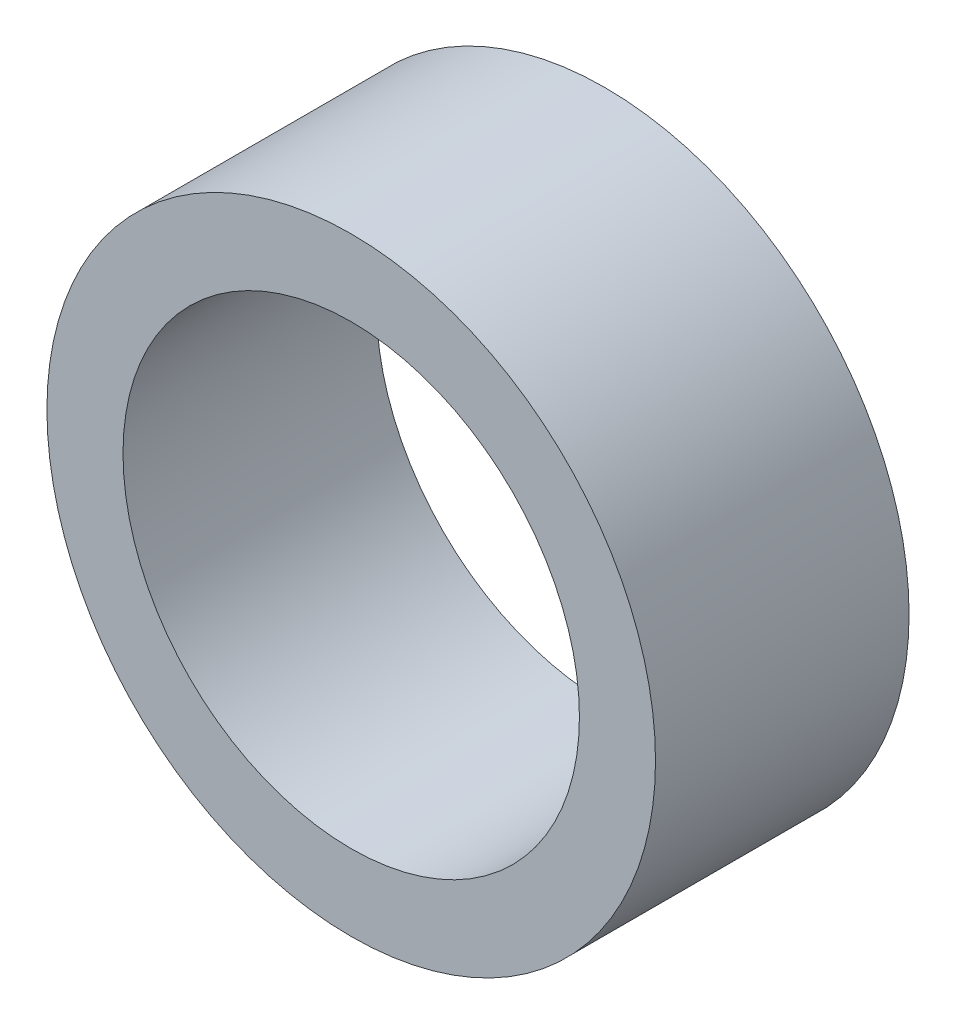
ISO-10303-21;
HEADER;
FILE_DESCRIPTION(('STEP AP214'),'2;1');
FILE_NAME('part.step','',(''),(''),'','','');
FILE_SCHEMA(('AUTOMOTIVE_DESIGN { 1 0 10303 214 1 1 1 1 }'));
ENDSEC;
DATA;
#1=APPLICATION_CONTEXT('core data for automotive mechanical design processes');
#2=APPLICATION_PROTOCOL_DEFINITION('international standard','automotive_design',2000,#1);
#3=PRODUCT_CONTEXT('',#1,'mechanical');
#4=PRODUCT('Part','Part','',(#3));
#5=PRODUCT_RELATED_PRODUCT_CATEGORY('part','',(#4));
#6=PRODUCT_DEFINITION_FORMATION('','',#4);
#7=PRODUCT_DEFINITION_CONTEXT('part definition',#1,'design');
#8=PRODUCT_DEFINITION('design','',#6,#7);
#9=PRODUCT_DEFINITION_SHAPE('','',#8);
#10=(LENGTH_UNIT() NAMED_UNIT(*) SI_UNIT(.MILLI.,.METRE.));
#11=(NAMED_UNIT(*) PLANE_ANGLE_UNIT() SI_UNIT($,.RADIAN.));
#12=(NAMED_UNIT(*) SI_UNIT($,.STERADIAN.) SOLID_ANGLE_UNIT());
#13=UNCERTAINTY_MEASURE_WITH_UNIT(LENGTH_MEASURE(1.E-05),#10,'distance_accuracy_value','');
#14=(GEOMETRIC_REPRESENTATION_CONTEXT(3) GLOBAL_UNCERTAINTY_ASSIGNED_CONTEXT((#13)) GLOBAL_UNIT_ASSIGNED_CONTEXT((#10,
#11,#12)) REPRESENTATION_CONTEXT('',''));
#15=CARTESIAN_POINT('',(0.,0.,0.));
#16=DIRECTION('',(0.,0.,1.));
#17=DIRECTION('',(1.,0.,0.));
#18=AXIS2_PLACEMENT_3D('',#15,#16,#17);
#19=CARTESIAN_POINT('',(0.,0.,5.));
#20=DIRECTION('',(0.,0.,-1.));
#21=DIRECTION('',(-1.,0.,0.));
#22=AXIS2_PLACEMENT_3D('',#19,#20,#21);
#23=CYLINDRICAL_SURFACE('',#22,6.);
#24=CARTESIAN_POINT('',(0.,0.,5.));
#25=DIRECTION('',(0.,0.,1.));
#26=DIRECTION('',(1.,0.,0.));
#27=AXIS2_PLACEMENT_3D('',#24,#25,#26);
#28=CIRCLE('',#27,6.);
#29=CARTESIAN_POINT('',(6.,0.,5.));
#30=VERTEX_POINT('',#29);
#31=EDGE_CURVE('E10',#30,#30,#28,.T.);
#32=ORIENTED_EDGE('',*,*,#31,.F.);
#33=EDGE_LOOP('',(#32));
#34=FACE_BOUND('',#33,.T.);
#35=CARTESIAN_POINT('',(0.,0.,0.));
#36=DIRECTION('',(0.,0.,1.));
#37=DIRECTION('',(1.,0.,0.));
#38=AXIS2_PLACEMENT_3D('',#35,#36,#37);
#39=CIRCLE('',#38,6.);
#40=CARTESIAN_POINT('',(6.,0.,0.));
#41=VERTEX_POINT('',#40);
#42=EDGE_CURVE('E36',#41,#41,#39,.T.);
#43=ORIENTED_EDGE('',*,*,#42,.T.);
#44=EDGE_LOOP('',(#43));
#45=FACE_BOUND('',#44,.T.);
#46=ADVANCED_FACE('F33',(#34,#45),#23,.T.);
#47=CARTESIAN_POINT('',(0.,0.,5.));
#48=DIRECTION('',(0.,0.,1.));
#49=DIRECTION('',(1.,0.,0.));
#50=AXIS2_PLACEMENT_3D('',#47,#48,#49);
#51=PLANE('',#50);
#52=CARTESIAN_POINT('',(0.,0.,5.));
#53=DIRECTION('',(0.,0.,1.));
#54=DIRECTION('',(1.,0.,0.));
#55=AXIS2_PLACEMENT_3D('',#52,#53,#54);
#56=CIRCLE('',#55,4.5);
#57=CARTESIAN_POINT('',(4.5,0.,5.));
#58=VERTEX_POINT('',#57);
#59=EDGE_CURVE('E45',#58,#58,#56,.T.);
#60=ORIENTED_EDGE('',*,*,#59,.F.);
#61=EDGE_LOOP('',(#60));
#62=FACE_BOUND('',#61,.T.);
#63=ORIENTED_EDGE('',*,*,#31,.T.);
#64=EDGE_LOOP('',(#63));
#65=FACE_BOUND('',#64,.T.);
#66=ADVANCED_FACE('F60',(#62,#65),#51,.T.);
#67=CARTESIAN_POINT('',(0.,0.,0.));
#68=DIRECTION('',(0.,0.,1.));
#69=DIRECTION('',(1.,0.,0.));
#70=AXIS2_PLACEMENT_3D('',#67,#68,#69);
#71=PLANE('',#70);
#72=CARTESIAN_POINT('',(0.,0.,0.));
#73=DIRECTION('',(0.,0.,1.));
#74=DIRECTION('',(1.,0.,0.));
#75=AXIS2_PLACEMENT_3D('',#72,#73,#74);
#76=CIRCLE('',#75,4.5);
#77=CARTESIAN_POINT('',(4.5,0.,0.));
#78=VERTEX_POINT('',#77);
#79=EDGE_CURVE('E43',#78,#78,#76,.T.);
#80=ORIENTED_EDGE('',*,*,#79,.T.);
#81=EDGE_LOOP('',(#80));
#82=FACE_BOUND('',#81,.T.);
#83=ORIENTED_EDGE('',*,*,#42,.F.);
#84=EDGE_LOOP('',(#83));
#85=FACE_BOUND('',#84,.T.);
#86=ADVANCED_FACE('F51',(#82,#85),#71,.F.);
#87=CARTESIAN_POINT('',(0.,0.,0.));
#88=DIRECTION('',(0.,0.,1.));
#89=DIRECTION('',(1.,0.,0.));
#90=AXIS2_PLACEMENT_3D('',#87,#88,#89);
#91=CYLINDRICAL_SURFACE('',#90,4.5);
#92=ORIENTED_EDGE('',*,*,#79,.F.);
#93=EDGE_LOOP('',(#92));
#94=FACE_BOUND('',#93,.T.);
#95=ORIENTED_EDGE('',*,*,#59,.T.);
#96=EDGE_LOOP('',(#95));
#97=FACE_BOUND('',#96,.T.);
#98=ADVANCED_FACE('F54',(#94,#97),#91,.F.);
#99=CLOSED_SHELL('',(#46,#66,#86,#98));
#100=MANIFOLD_SOLID_BREP('B2',#99);
#101=ADVANCED_BREP_SHAPE_REPRESENTATION('',(#18,#100),#14);
#102=SHAPE_DEFINITION_REPRESENTATION(#9,#101);
ENDSEC;
END-ISO-10303-21;
